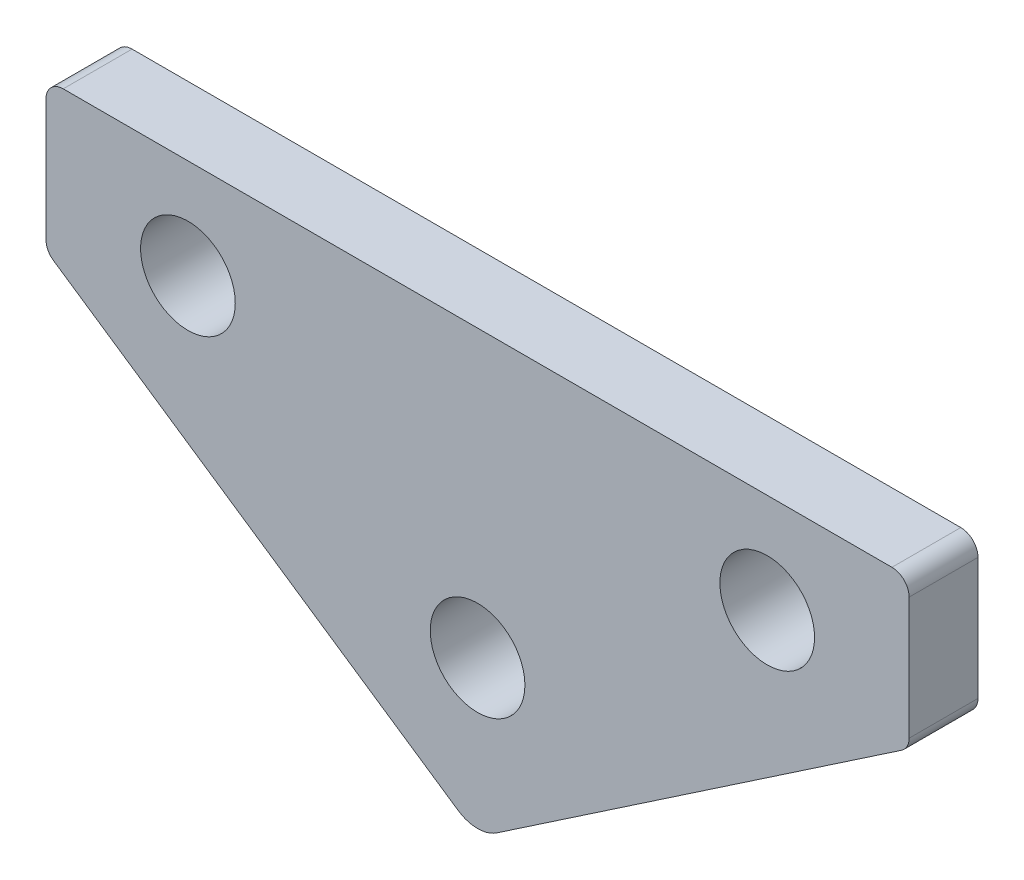
ISO-10303-21;
HEADER;
FILE_DESCRIPTION(('STEP AP214'),'2;1');
FILE_NAME('part.step','',(''),(''),'','','');
FILE_SCHEMA(('AUTOMOTIVE_DESIGN { 1 0 10303 214 1 1 1 1 }'));
ENDSEC;
DATA;
#1=APPLICATION_CONTEXT('core data for automotive mechanical design processes');
#2=APPLICATION_PROTOCOL_DEFINITION('international standard','automotive_design',2000,#1);
#3=PRODUCT_CONTEXT('',#1,'mechanical');
#4=PRODUCT('Part','Part','',(#3));
#5=PRODUCT_RELATED_PRODUCT_CATEGORY('part','',(#4));
#6=PRODUCT_DEFINITION_FORMATION('','',#4);
#7=PRODUCT_DEFINITION_CONTEXT('part definition',#1,'design');
#8=PRODUCT_DEFINITION('design','',#6,#7);
#9=PRODUCT_DEFINITION_SHAPE('','',#8);
#10=(LENGTH_UNIT() NAMED_UNIT(*) SI_UNIT(.MILLI.,.METRE.));
#11=(NAMED_UNIT(*) PLANE_ANGLE_UNIT() SI_UNIT($,.RADIAN.));
#12=(NAMED_UNIT(*) SI_UNIT($,.STERADIAN.) SOLID_ANGLE_UNIT());
#13=UNCERTAINTY_MEASURE_WITH_UNIT(LENGTH_MEASURE(1.E-05),#10,'distance_accuracy_value','');
#14=(GEOMETRIC_REPRESENTATION_CONTEXT(3) GLOBAL_UNCERTAINTY_ASSIGNED_CONTEXT((#13)) GLOBAL_UNIT_ASSIGNED_CONTEXT((#10,
#11,#12)) REPRESENTATION_CONTEXT('',''));
#15=CARTESIAN_POINT('',(0.,0.,0.));
#16=DIRECTION('',(0.,0.,1.));
#17=DIRECTION('',(1.,0.,0.));
#18=AXIS2_PLACEMENT_3D('',#15,#16,#17);
#19=CARTESIAN_POINT('',(24.0721783393802,15.5927116999957,4.));
#20=DIRECTION('',(0.,0.,-1.));
#21=DIRECTION('',(-1.,0.,0.));
#22=AXIS2_PLACEMENT_3D('',#19,#20,#21);
#23=CYLINDRICAL_SURFACE('',#22,1.);
#24=CARTESIAN_POINT('',(24.0721783393802,15.5927116999957,0.));
#25=DIRECTION('',(0.,0.,1.));
#26=DIRECTION('',(1.,0.,0.));
#27=AXIS2_PLACEMENT_3D('',#24,#25,#26);
#28=CIRCLE('',#27,1.);
#29=CARTESIAN_POINT('',(24.0721783393802,16.5927116999957,0.));
#30=VERTEX_POINT('',#29);
#31=CARTESIAN_POINT('',(25.0721783393802,15.5927116999957,0.));
#32=VERTEX_POINT('',#31);
#33=EDGE_CURVE('E160',#30,#32,#28,.F.);
#34=ORIENTED_EDGE('',*,*,#33,.F.);
#35=DIRECTION('',(0.,0.,-1.));
#36=VECTOR('',#35,1.);
#37=CARTESIAN_POINT('',(24.0721783393802,16.5927116999957,4.));
#38=LINE('',#37,#36);
#39=CARTESIAN_POINT('',(24.0721783393802,16.5927116999957,4.));
#40=VERTEX_POINT('',#39);
#41=EDGE_CURVE('E11',#40,#30,#38,.T.);
#42=ORIENTED_EDGE('',*,*,#41,.F.);
#43=CARTESIAN_POINT('',(24.0721783393802,15.5927116999957,4.));
#44=DIRECTION('',(0.,0.,1.));
#45=DIRECTION('',(1.,0.,0.));
#46=AXIS2_PLACEMENT_3D('',#43,#44,#45);
#47=CIRCLE('',#46,1.);
#48=CARTESIAN_POINT('',(25.0721783393802,15.5927116999957,4.));
#49=VERTEX_POINT('',#48);
#50=EDGE_CURVE('E231',#40,#49,#47,.F.);
#51=ORIENTED_EDGE('',*,*,#50,.T.);
#52=DIRECTION('',(0.,0.,-1.));
#53=VECTOR('',#52,1.);
#54=CARTESIAN_POINT('',(25.0721783393802,15.5927116999957,4.));
#55=LINE('',#54,#53);
#56=EDGE_CURVE('E59',#49,#32,#55,.T.);
#57=ORIENTED_EDGE('',*,*,#56,.T.);
#58=EDGE_LOOP('',(#34,#42,#51,#57));
#59=FACE_BOUND('',#58,.T.);
#60=ADVANCED_FACE('F42',(#59),#23,.T.);
#61=CARTESIAN_POINT('',(0.,16.5927116999957,4.));
#62=DIRECTION('',(0.,-1.,0.));
#63=DIRECTION('',(0.,0.,-1.));
#64=AXIS2_PLACEMENT_3D('',#61,#62,#63);
#65=PLANE('',#64);
#66=DIRECTION('',(-1.,0.,0.));
#67=VECTOR('',#66,1.);
#68=CARTESIAN_POINT('',(0.,16.5927116999957,0.));
#69=LINE('',#68,#67);
#70=CARTESIAN_POINT('',(-24.0721783393802,16.5927116999957,0.));
#71=VERTEX_POINT('',#70);
#72=EDGE_CURVE('E162',#30,#71,#69,.T.);
#73=ORIENTED_EDGE('',*,*,#72,.T.);
#74=DIRECTION('',(0.,0.,-1.));
#75=VECTOR('',#74,1.);
#76=CARTESIAN_POINT('',(-24.0721783393802,16.5927116999957,4.));
#77=LINE('',#76,#75);
#78=CARTESIAN_POINT('',(-24.0721783393802,16.5927116999957,4.));
#79=VERTEX_POINT('',#78);
#80=EDGE_CURVE('E51',#79,#71,#77,.T.);
#81=ORIENTED_EDGE('',*,*,#80,.F.);
#82=DIRECTION('',(-1.,0.,0.));
#83=VECTOR('',#82,1.);
#84=CARTESIAN_POINT('',(0.,16.5927116999957,4.));
#85=LINE('',#84,#83);
#86=EDGE_CURVE('E229',#40,#79,#85,.T.);
#87=ORIENTED_EDGE('',*,*,#86,.F.);
#88=ORIENTED_EDGE('',*,*,#41,.T.);
#89=EDGE_LOOP('',(#73,#81,#87,#88));
#90=FACE_BOUND('',#89,.T.);
#91=ADVANCED_FACE('F215',(#90),#65,.F.);
#92=CARTESIAN_POINT('',(-24.0721783393802,15.5927116999957,4.));
#93=DIRECTION('',(0.,0.,-1.));
#94=DIRECTION('',(-1.,0.,0.));
#95=AXIS2_PLACEMENT_3D('',#92,#93,#94);
#96=CYLINDRICAL_SURFACE('',#95,1.);
#97=CARTESIAN_POINT('',(-24.0721783393802,15.5927116999957,0.));
#98=DIRECTION('',(0.,0.,1.));
#99=DIRECTION('',(1.,0.,0.));
#100=AXIS2_PLACEMENT_3D('',#97,#98,#99);
#101=CIRCLE('',#100,1.);
#102=CARTESIAN_POINT('',(-25.0721783393802,15.5927116999957,0.));
#103=VERTEX_POINT('',#102);
#104=EDGE_CURVE('E165',#103,#71,#101,.F.);
#105=ORIENTED_EDGE('',*,*,#104,.F.);
#106=DIRECTION('',(0.,0.,-1.));
#107=VECTOR('',#106,1.);
#108=CARTESIAN_POINT('',(-25.0721783393802,15.5927116999957,4.));
#109=LINE('',#108,#107);
#110=CARTESIAN_POINT('',(-25.0721783393802,15.5927116999957,4.));
#111=VERTEX_POINT('',#110);
#112=EDGE_CURVE('E205',#111,#103,#109,.T.);
#113=ORIENTED_EDGE('',*,*,#112,.F.);
#114=CARTESIAN_POINT('',(-24.0721783393802,15.5927116999957,4.));
#115=DIRECTION('',(0.,0.,1.));
#116=DIRECTION('',(1.,0.,0.));
#117=AXIS2_PLACEMENT_3D('',#114,#115,#116);
#118=CIRCLE('',#117,1.);
#119=EDGE_CURVE('E212',#111,#79,#118,.F.);
#120=ORIENTED_EDGE('',*,*,#119,.T.);
#121=ORIENTED_EDGE('',*,*,#80,.T.);
#122=EDGE_LOOP('',(#105,#113,#120,#121));
#123=FACE_BOUND('',#122,.T.);
#124=ADVANCED_FACE('F210',(#123),#96,.T.);
#125=CARTESIAN_POINT('',(-25.0721783393802,0.,4.));
#126=DIRECTION('',(1.,0.,0.));
#127=DIRECTION('',(0.,0.,-1.));
#128=AXIS2_PLACEMENT_3D('',#125,#126,#127);
#129=PLANE('',#128);
#130=DIRECTION('',(0.,-1.,0.));
#131=VECTOR('',#130,1.);
#132=CARTESIAN_POINT('',(-25.0721783393802,0.,0.));
#133=LINE('',#132,#131);
#134=CARTESIAN_POINT('',(-25.0721783393802,8.49545413987685,0.));
#135=VERTEX_POINT('',#134);
#136=EDGE_CURVE('E168',#103,#135,#133,.T.);
#137=ORIENTED_EDGE('',*,*,#136,.T.);
#138=DIRECTION('',(0.,0.,-1.));
#139=VECTOR('',#138,1.);
#140=CARTESIAN_POINT('',(-25.0721783393802,8.49545413987685,4.));
#141=LINE('',#140,#139);
#142=CARTESIAN_POINT('',(-25.0721783393802,8.49545413987685,4.));
#143=VERTEX_POINT('',#142);
#144=EDGE_CURVE('E202',#143,#135,#141,.T.);
#145=ORIENTED_EDGE('',*,*,#144,.F.);
#146=DIRECTION('',(0.,-1.,0.));
#147=VECTOR('',#146,1.);
#148=CARTESIAN_POINT('',(-25.0721783393802,0.,4.));
#149=LINE('',#148,#147);
#150=EDGE_CURVE('E225',#111,#143,#149,.T.);
#151=ORIENTED_EDGE('',*,*,#150,.F.);
#152=ORIENTED_EDGE('',*,*,#112,.T.);
#153=EDGE_LOOP('',(#137,#145,#151,#152));
#154=FACE_BOUND('',#153,.T.);
#155=ADVANCED_FACE('F222',(#154),#129,.F.);
#156=CARTESIAN_POINT('',(-24.0721783393802,8.49545413987685,4.));
#157=DIRECTION('',(0.,0.,-1.));
#158=DIRECTION('',(-1.,0.,0.));
#159=AXIS2_PLACEMENT_3D('',#156,#157,#158);
#160=CYLINDRICAL_SURFACE('',#159,1.);
#161=CARTESIAN_POINT('',(-24.0721783393802,8.49545413987685,0.));
#162=DIRECTION('',(0.,0.,1.));
#163=DIRECTION('',(1.,0.,0.));
#164=AXIS2_PLACEMENT_3D('',#161,#162,#163);
#165=CIRCLE('',#164,1.);
#166=CARTESIAN_POINT('',(-24.6326631976635,7.6672894680662,0.));
#167=VERTEX_POINT('',#166);
#168=EDGE_CURVE('E171',#135,#167,#165,.T.);
#169=ORIENTED_EDGE('',*,*,#168,.T.);
#170=DIRECTION('',(0.,0.,-1.));
#171=VECTOR('',#170,1.);
#172=CARTESIAN_POINT('',(-24.6326631976635,7.6672894680662,4.));
#173=LINE('',#172,#171);
#174=CARTESIAN_POINT('',(-24.6326631976635,7.6672894680662,4.));
#175=VERTEX_POINT('',#174);
#176=EDGE_CURVE('E199',#175,#167,#173,.T.);
#177=ORIENTED_EDGE('',*,*,#176,.F.);
#178=CARTESIAN_POINT('',(-24.0721783393802,8.49545413987685,4.));
#179=DIRECTION('',(0.,0.,1.));
#180=DIRECTION('',(1.,0.,0.));
#181=AXIS2_PLACEMENT_3D('',#178,#179,#180);
#182=CIRCLE('',#181,1.);
#183=EDGE_CURVE('E227',#143,#175,#182,.T.);
#184=ORIENTED_EDGE('',*,*,#183,.F.);
#185=ORIENTED_EDGE('',*,*,#144,.T.);
#186=EDGE_LOOP('',(#169,#177,#184,#185));
#187=FACE_BOUND('',#186,.T.);
#188=ADVANCED_FACE('F264',(#187),#160,.T.);
#189=CARTESIAN_POINT('',(-4.17923095095574,-6.17517382988826,4.));
#190=DIRECTION('',(0.560484858283219,0.828164671810649,0.));
#191=DIRECTION('',(-0.828164671810649,0.560484858283219,0.));
#192=AXIS2_PLACEMENT_3D('',#189,#190,#191);
#193=PLANE('',#192);
#194=DIRECTION('',(0.828164671810649,-0.560484858283219,0.));
#195=VECTOR('',#194,1.);
#196=CARTESIAN_POINT('',(-4.17923095095574,-6.17517382988826,0.));
#197=LINE('',#196,#195);
#198=CARTESIAN_POINT('',(-1.12096971656645,-8.24494228644669,0.));
#199=VERTEX_POINT('',#198);
#200=EDGE_CURVE('E174',#167,#199,#197,.T.);
#201=ORIENTED_EDGE('',*,*,#200,.T.);
#202=DIRECTION('',(0.,0.,-1.));
#203=VECTOR('',#202,1.);
#204=CARTESIAN_POINT('',(-1.12096971656645,-8.24494228644669,4.));
#205=LINE('',#204,#203);
#206=CARTESIAN_POINT('',(-1.12096971656645,-8.24494228644669,4.));
#207=VERTEX_POINT('',#206);
#208=EDGE_CURVE('E196',#207,#199,#205,.T.);
#209=ORIENTED_EDGE('',*,*,#208,.F.);
#210=DIRECTION('',(0.828164671810649,-0.560484858283219,0.));
#211=VECTOR('',#210,1.);
#212=CARTESIAN_POINT('',(-4.17923095095574,-6.17517382988826,4.));
#213=LINE('',#212,#211);
#214=EDGE_CURVE('E146',#175,#207,#213,.T.);
#215=ORIENTED_EDGE('',*,*,#214,.F.);
#216=ORIENTED_EDGE('',*,*,#176,.T.);
#217=EDGE_LOOP('',(#201,#209,#215,#216));
#218=FACE_BOUND('',#217,.T.);
#219=ADVANCED_FACE('F238',(#218),#193,.F.);
#220=CARTESIAN_POINT('',(0.,-6.5886129428254,4.));
#221=DIRECTION('',(0.,0.,-1.));
#222=DIRECTION('',(-1.,0.,0.));
#223=AXIS2_PLACEMENT_3D('',#220,#221,#222);
#224=CYLINDRICAL_SURFACE('',#223,2.);
#225=CARTESIAN_POINT('',(0.,-6.5886129428254,0.));
#226=DIRECTION('',(0.,0.,1.));
#227=DIRECTION('',(1.,0.,0.));
#228=AXIS2_PLACEMENT_3D('',#225,#226,#227);
#229=CIRCLE('',#228,2.);
#230=CARTESIAN_POINT('',(1.12096971656645,-8.24494228644669,0.));
#231=VERTEX_POINT('',#230);
#232=EDGE_CURVE('E177',#199,#231,#229,.T.);
#233=ORIENTED_EDGE('',*,*,#232,.T.);
#234=DIRECTION('',(0.,0.,-1.));
#235=VECTOR('',#234,1.);
#236=CARTESIAN_POINT('',(1.12096971656645,-8.24494228644669,4.));
#237=LINE('',#236,#235);
#238=CARTESIAN_POINT('',(1.12096971656645,-8.24494228644669,4.));
#239=VERTEX_POINT('',#238);
#240=EDGE_CURVE('E131',#239,#231,#237,.T.);
#241=ORIENTED_EDGE('',*,*,#240,.F.);
#242=CARTESIAN_POINT('',(0.,-6.5886129428254,4.));
#243=DIRECTION('',(0.,0.,1.));
#244=DIRECTION('',(1.,0.,0.));
#245=AXIS2_PLACEMENT_3D('',#242,#243,#244);
#246=CIRCLE('',#245,2.);
#247=EDGE_CURVE('E143',#207,#239,#246,.T.);
#248=ORIENTED_EDGE('',*,*,#247,.F.);
#249=ORIENTED_EDGE('',*,*,#208,.T.);
#250=EDGE_LOOP('',(#233,#241,#248,#249));
#251=FACE_BOUND('',#250,.T.);
#252=ADVANCED_FACE('F240',(#251),#224,.T.);
#253=CARTESIAN_POINT('',(4.17923095095574,-6.17517382988826,4.));
#254=DIRECTION('',(0.560484858283219,-0.828164671810649,0.));
#255=DIRECTION('',(0.828164671810649,0.560484858283219,0.));
#256=AXIS2_PLACEMENT_3D('',#253,#254,#255);
#257=PLANE('',#256);
#258=DIRECTION('',(-0.828164671810649,-0.560484858283219,0.));
#259=VECTOR('',#258,1.);
#260=CARTESIAN_POINT('',(4.17923095095574,-6.17517382988826,0.));
#261=LINE('',#260,#259);
#262=CARTESIAN_POINT('',(24.6326631976635,7.6672894680662,0.));
#263=VERTEX_POINT('',#262);
#264=EDGE_CURVE('E128',#263,#231,#261,.T.);
#265=ORIENTED_EDGE('',*,*,#264,.F.);
#266=DIRECTION('',(0.,0.,-1.));
#267=VECTOR('',#266,1.);
#268=CARTESIAN_POINT('',(24.6326631976635,7.6672894680662,4.));
#269=LINE('',#268,#267);
#270=CARTESIAN_POINT('',(24.6326631976635,7.6672894680662,4.));
#271=VERTEX_POINT('',#270);
#272=EDGE_CURVE('E122',#271,#263,#269,.T.);
#273=ORIENTED_EDGE('',*,*,#272,.F.);
#274=DIRECTION('',(-0.828164671810649,-0.560484858283219,0.));
#275=VECTOR('',#274,1.);
#276=CARTESIAN_POINT('',(4.17923095095574,-6.17517382988826,4.));
#277=LINE('',#276,#275);
#278=EDGE_CURVE('E126',#271,#239,#277,.T.);
#279=ORIENTED_EDGE('',*,*,#278,.T.);
#280=ORIENTED_EDGE('',*,*,#240,.T.);
#281=EDGE_LOOP('',(#265,#273,#279,#280));
#282=FACE_BOUND('',#281,.T.);
#283=ADVANCED_FACE('F124',(#282),#257,.T.);
#284=CARTESIAN_POINT('',(24.0721783393802,8.49545413987685,4.));
#285=DIRECTION('',(0.,0.,-1.));
#286=DIRECTION('',(-1.,0.,0.));
#287=AXIS2_PLACEMENT_3D('',#284,#285,#286);
#288=CYLINDRICAL_SURFACE('',#287,1.);
#289=CARTESIAN_POINT('',(24.0721783393802,8.49545413987685,0.));
#290=DIRECTION('',(0.,0.,1.));
#291=DIRECTION('',(1.,0.,0.));
#292=AXIS2_PLACEMENT_3D('',#289,#290,#291);
#293=CIRCLE('',#292,1.);
#294=CARTESIAN_POINT('',(25.0721783393802,8.49545413987685,0.));
#295=VERTEX_POINT('',#294);
#296=EDGE_CURVE('E181',#263,#295,#293,.T.);
#297=ORIENTED_EDGE('',*,*,#296,.T.);
#298=DIRECTION('',(0.,0.,-1.));
#299=VECTOR('',#298,1.);
#300=CARTESIAN_POINT('',(25.0721783393802,8.49545413987685,4.));
#301=LINE('',#300,#299);
#302=CARTESIAN_POINT('',(25.0721783393802,8.49545413987685,4.));
#303=VERTEX_POINT('',#302);
#304=EDGE_CURVE('E91',#303,#295,#301,.T.);
#305=ORIENTED_EDGE('',*,*,#304,.F.);
#306=CARTESIAN_POINT('',(24.0721783393802,8.49545413987685,4.));
#307=DIRECTION('',(0.,0.,1.));
#308=DIRECTION('',(1.,0.,0.));
#309=AXIS2_PLACEMENT_3D('',#306,#307,#308);
#310=CIRCLE('',#309,1.);
#311=EDGE_CURVE('E133',#271,#303,#310,.T.);
#312=ORIENTED_EDGE('',*,*,#311,.F.);
#313=ORIENTED_EDGE('',*,*,#272,.T.);
#314=EDGE_LOOP('',(#297,#305,#312,#313));
#315=FACE_BOUND('',#314,.T.);
#316=ADVANCED_FACE('F134',(#315),#288,.T.);
#317=CARTESIAN_POINT('',(16.8270949567841,10.8096658281083,4.));
#318=DIRECTION('',(0.,0.,-1.));
#319=DIRECTION('',(-1.,0.,0.));
#320=AXIS2_PLACEMENT_3D('',#317,#318,#319);
#321=CYLINDRICAL_SURFACE('',#320,2.75);
#322=CARTESIAN_POINT('',(16.8270949567841,10.8096658281083,4.));
#323=DIRECTION('',(0.,0.,1.));
#324=DIRECTION('',(1.,0.,0.));
#325=AXIS2_PLACEMENT_3D('',#322,#323,#324);
#326=CIRCLE('',#325,2.75);
#327=CARTESIAN_POINT('',(19.5770949567841,10.8096658281083,4.));
#328=VERTEX_POINT('',#327);
#329=EDGE_CURVE('E151',#328,#328,#326,.F.);
#330=ORIENTED_EDGE('',*,*,#329,.F.);
#331=EDGE_LOOP('',(#330));
#332=FACE_BOUND('',#331,.T.);
#333=CARTESIAN_POINT('',(16.8270949567841,10.8096658281083,0.));
#334=DIRECTION('',(0.,0.,1.));
#335=DIRECTION('',(1.,0.,0.));
#336=AXIS2_PLACEMENT_3D('',#333,#334,#335);
#337=CIRCLE('',#336,2.75);
#338=CARTESIAN_POINT('',(19.5770949567841,10.8096658281083,0.));
#339=VERTEX_POINT('',#338);
#340=EDGE_CURVE('E186',#339,#339,#337,.F.);
#341=ORIENTED_EDGE('',*,*,#340,.T.);
#342=EDGE_LOOP('',(#341));
#343=FACE_BOUND('',#342,.T.);
#344=ADVANCED_FACE('F243',(#332,#343),#321,.F.);
#345=CARTESIAN_POINT('',(25.0721783393802,0.,4.));
#346=DIRECTION('',(1.,0.,0.));
#347=DIRECTION('',(0.,0.,-1.));
#348=AXIS2_PLACEMENT_3D('',#345,#346,#347);
#349=PLANE('',#348);
#350=DIRECTION('',(0.,-1.,0.));
#351=VECTOR('',#350,1.);
#352=CARTESIAN_POINT('',(25.0721783393802,0.,0.));
#353=LINE('',#352,#351);
#354=EDGE_CURVE('E183',#32,#295,#353,.T.);
#355=ORIENTED_EDGE('',*,*,#354,.F.);
#356=ORIENTED_EDGE('',*,*,#56,.F.);
#357=DIRECTION('',(0.,-1.,0.));
#358=VECTOR('',#357,1.);
#359=CARTESIAN_POINT('',(25.0721783393802,0.,4.));
#360=LINE('',#359,#358);
#361=EDGE_CURVE('E137',#49,#303,#360,.T.);
#362=ORIENTED_EDGE('',*,*,#361,.T.);
#363=ORIENTED_EDGE('',*,*,#304,.T.);
#364=EDGE_LOOP('',(#355,#356,#362,#363));
#365=FACE_BOUND('',#364,.T.);
#366=ADVANCED_FACE('F241',(#365),#349,.T.);
#367=CARTESIAN_POINT('',(-16.8270949567841,10.8096658281083,4.));
#368=DIRECTION('',(0.,0.,-1.));
#369=DIRECTION('',(-1.,0.,0.));
#370=AXIS2_PLACEMENT_3D('',#367,#368,#369);
#371=CYLINDRICAL_SURFACE('',#370,2.75);
#372=CARTESIAN_POINT('',(-16.8270949567841,10.8096658281083,4.));
#373=DIRECTION('',(0.,0.,1.));
#374=DIRECTION('',(1.,0.,0.));
#375=AXIS2_PLACEMENT_3D('',#372,#373,#374);
#376=CIRCLE('',#375,2.75);
#377=CARTESIAN_POINT('',(-14.0770949567841,10.8096658281083,4.));
#378=VERTEX_POINT('',#377);
#379=EDGE_CURVE('E192',#378,#378,#376,.T.);
#380=ORIENTED_EDGE('',*,*,#379,.T.);
#381=EDGE_LOOP('',(#380));
#382=FACE_BOUND('',#381,.T.);
#383=CARTESIAN_POINT('',(-16.8270949567841,10.8096658281083,0.));
#384=DIRECTION('',(0.,0.,1.));
#385=DIRECTION('',(1.,0.,0.));
#386=AXIS2_PLACEMENT_3D('',#383,#384,#385);
#387=CIRCLE('',#386,2.75);
#388=CARTESIAN_POINT('',(-14.0770949567841,10.8096658281083,0.));
#389=VERTEX_POINT('',#388);
#390=EDGE_CURVE('E157',#389,#389,#387,.T.);
#391=ORIENTED_EDGE('',*,*,#390,.F.);
#392=EDGE_LOOP('',(#391));
#393=FACE_BOUND('',#392,.T.);
#394=ADVANCED_FACE('F44',(#382,#393),#371,.F.);
#395=CARTESIAN_POINT('',(0.,0.,4.));
#396=DIRECTION('',(0.,0.,-1.));
#397=DIRECTION('',(-1.,0.,0.));
#398=AXIS2_PLACEMENT_3D('',#395,#396,#397);
#399=CYLINDRICAL_SURFACE('',#398,2.75);
#400=CARTESIAN_POINT('',(0.,0.,4.));
#401=DIRECTION('',(0.,0.,1.));
#402=DIRECTION('',(1.,0.,0.));
#403=AXIS2_PLACEMENT_3D('',#400,#401,#402);
#404=CIRCLE('',#403,2.75);
#405=CARTESIAN_POINT('',(2.75,0.,4.));
#406=VERTEX_POINT('',#405);
#407=EDGE_CURVE('E154',#406,#406,#404,.T.);
#408=ORIENTED_EDGE('',*,*,#407,.T.);
#409=EDGE_LOOP('',(#408));
#410=FACE_BOUND('',#409,.T.);
#411=CARTESIAN_POINT('',(0.,0.,0.));
#412=DIRECTION('',(0.,0.,1.));
#413=DIRECTION('',(1.,0.,0.));
#414=AXIS2_PLACEMENT_3D('',#411,#412,#413);
#415=CIRCLE('',#414,2.75);
#416=CARTESIAN_POINT('',(2.75,0.,0.));
#417=VERTEX_POINT('',#416);
#418=EDGE_CURVE('E189',#417,#417,#415,.T.);
#419=ORIENTED_EDGE('',*,*,#418,.F.);
#420=EDGE_LOOP('',(#419));
#421=FACE_BOUND('',#420,.T.);
#422=ADVANCED_FACE('F249',(#410,#421),#399,.F.);
#423=CARTESIAN_POINT('',(0.,0.,4.));
#424=DIRECTION('',(0.,0.,1.));
#425=DIRECTION('',(1.,0.,0.));
#426=AXIS2_PLACEMENT_3D('',#423,#424,#425);
#427=PLANE('',#426);
#428=ORIENTED_EDGE('',*,*,#379,.F.);
#429=EDGE_LOOP('',(#428));
#430=FACE_BOUND('',#429,.T.);
#431=ORIENTED_EDGE('',*,*,#50,.F.);
#432=ORIENTED_EDGE('',*,*,#86,.T.);
#433=ORIENTED_EDGE('',*,*,#119,.F.);
#434=ORIENTED_EDGE('',*,*,#150,.T.);
#435=ORIENTED_EDGE('',*,*,#183,.T.);
#436=ORIENTED_EDGE('',*,*,#214,.T.);
#437=ORIENTED_EDGE('',*,*,#247,.T.);
#438=ORIENTED_EDGE('',*,*,#278,.F.);
#439=ORIENTED_EDGE('',*,*,#311,.T.);
#440=ORIENTED_EDGE('',*,*,#361,.F.);
#441=EDGE_LOOP('',(#431,#432,#433,#434,#435,#436,#437,#438,#439,#440));
#442=FACE_BOUND('',#441,.T.);
#443=ORIENTED_EDGE('',*,*,#329,.T.);
#444=EDGE_LOOP('',(#443));
#445=FACE_BOUND('',#444,.T.);
#446=ORIENTED_EDGE('',*,*,#407,.F.);
#447=EDGE_LOOP('',(#446));
#448=FACE_BOUND('',#447,.T.);
#449=ADVANCED_FACE('F140',(#430,#442,#445,#448),#427,.T.);
#450=CARTESIAN_POINT('',(0.,0.,0.));
#451=DIRECTION('',(0.,0.,1.));
#452=DIRECTION('',(1.,0.,0.));
#453=AXIS2_PLACEMENT_3D('',#450,#451,#452);
#454=PLANE('',#453);
#455=ORIENTED_EDGE('',*,*,#390,.T.);
#456=EDGE_LOOP('',(#455));
#457=FACE_BOUND('',#456,.T.);
#458=ORIENTED_EDGE('',*,*,#33,.T.);
#459=ORIENTED_EDGE('',*,*,#354,.T.);
#460=ORIENTED_EDGE('',*,*,#296,.F.);
#461=ORIENTED_EDGE('',*,*,#264,.T.);
#462=ORIENTED_EDGE('',*,*,#232,.F.);
#463=ORIENTED_EDGE('',*,*,#200,.F.);
#464=ORIENTED_EDGE('',*,*,#168,.F.);
#465=ORIENTED_EDGE('',*,*,#136,.F.);
#466=ORIENTED_EDGE('',*,*,#104,.T.);
#467=ORIENTED_EDGE('',*,*,#72,.F.);
#468=EDGE_LOOP('',(#458,#459,#460,#461,#462,#463,#464,#465,#466,#467));
#469=FACE_BOUND('',#468,.T.);
#470=ORIENTED_EDGE('',*,*,#340,.F.);
#471=EDGE_LOOP('',(#470));
#472=FACE_BOUND('',#471,.T.);
#473=ORIENTED_EDGE('',*,*,#418,.T.);
#474=EDGE_LOOP('',(#473));
#475=FACE_BOUND('',#474,.T.);
#476=ADVANCED_FACE('F218',(#457,#469,#472,#475),#454,.F.);
#477=CLOSED_SHELL('',(#60,#91,#124,#155,#188,#219,#252,#283,#316,#344,#366,#394,#422,#449,#476));
#478=MANIFOLD_SOLID_BREP('B2',#477);
#479=ADVANCED_BREP_SHAPE_REPRESENTATION('',(#18,#478),#14);
#480=SHAPE_DEFINITION_REPRESENTATION(#9,#479);
ENDSEC;
END-ISO-10303-21;
